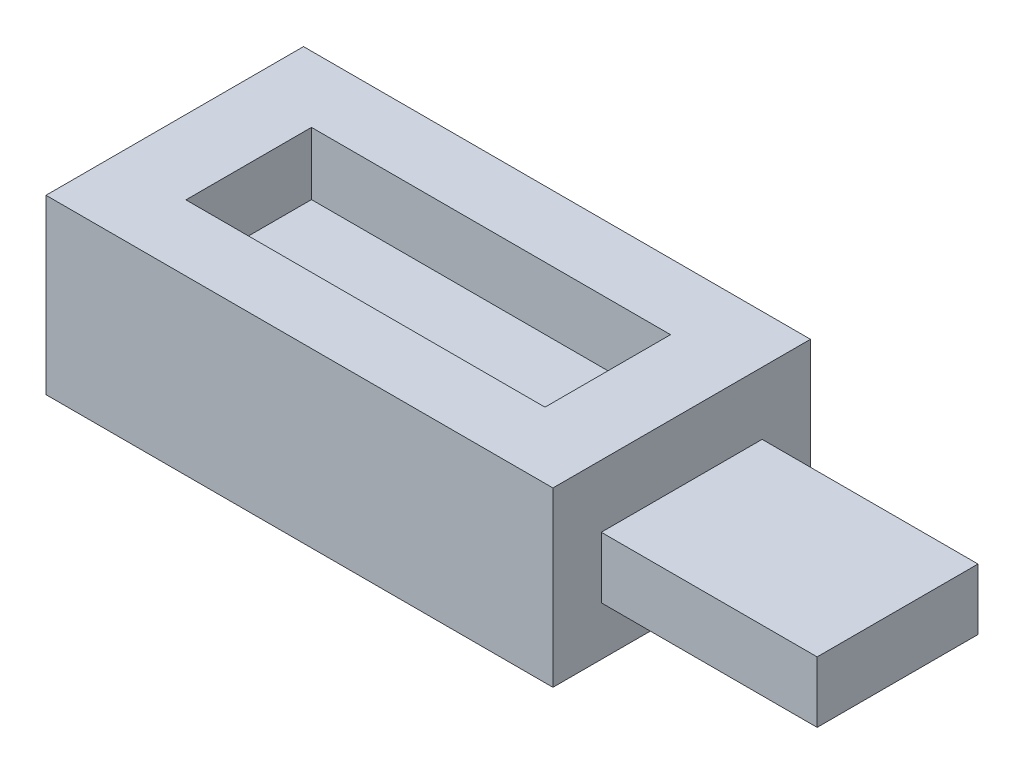
ISO-10303-21;
HEADER;
FILE_DESCRIPTION(('STEP AP214'),'2;1');
FILE_NAME('part.step','',(''),(''),'','','');
FILE_SCHEMA(('AUTOMOTIVE_DESIGN { 1 0 10303 214 1 1 1 1 }'));
ENDSEC;
DATA;
#1=APPLICATION_CONTEXT('core data for automotive mechanical design processes');
#2=APPLICATION_PROTOCOL_DEFINITION('international standard','automotive_design',2000,#1);
#3=PRODUCT_CONTEXT('',#1,'mechanical');
#4=PRODUCT('Part','Part','',(#3));
#5=PRODUCT_RELATED_PRODUCT_CATEGORY('part','',(#4));
#6=PRODUCT_DEFINITION_FORMATION('','',#4);
#7=PRODUCT_DEFINITION_CONTEXT('part definition',#1,'design');
#8=PRODUCT_DEFINITION('design','',#6,#7);
#9=PRODUCT_DEFINITION_SHAPE('','',#8);
#10=(LENGTH_UNIT() NAMED_UNIT(*) SI_UNIT(.MILLI.,.METRE.));
#11=(NAMED_UNIT(*) PLANE_ANGLE_UNIT() SI_UNIT($,.RADIAN.));
#12=(NAMED_UNIT(*) SI_UNIT($,.STERADIAN.) SOLID_ANGLE_UNIT());
#13=UNCERTAINTY_MEASURE_WITH_UNIT(LENGTH_MEASURE(1.E-05),#10,'distance_accuracy_value','');
#14=(GEOMETRIC_REPRESENTATION_CONTEXT(3) GLOBAL_UNCERTAINTY_ASSIGNED_CONTEXT((#13)) GLOBAL_UNIT_ASSIGNED_CONTEXT((#10,
#11,#12)) REPRESENTATION_CONTEXT('',''));
#15=CARTESIAN_POINT('',(0.,0.,0.));
#16=DIRECTION('',(0.,0.,1.));
#17=DIRECTION('',(1.,0.,0.));
#18=AXIS2_PLACEMENT_3D('',#15,#16,#17);
#19=CARTESIAN_POINT('',(102.892841401862,70.104,52.2673742227546));
#20=DIRECTION('',(-1.,0.,0.));
#21=DIRECTION('',(0.,0.,1.));
#22=AXIS2_PLACEMENT_3D('',#19,#20,#21);
#23=PLANE('',#22);
#24=DIRECTION('',(0.,0.,-1.));
#25=VECTOR('',#24,1.);
#26=CARTESIAN_POINT('',(102.892841401862,0.,52.2673742227546));
#27=LINE('',#26,#25);
#28=CARTESIAN_POINT('',(102.892841401862,0.,52.2673742227546));
#29=VERTEX_POINT('',#28);
#30=CARTESIAN_POINT('',(102.892841401862,0.,-52.2673742227546));
#31=VERTEX_POINT('',#30);
#32=EDGE_CURVE('E173',#29,#31,#27,.T.);
#33=ORIENTED_EDGE('',*,*,#32,.T.);
#34=DIRECTION('',(0.,-1.,0.));
#35=VECTOR('',#34,1.);
#36=CARTESIAN_POINT('',(102.892841401862,70.104,-52.2673742227546));
#37=LINE('',#36,#35);
#38=CARTESIAN_POINT('',(102.892841401862,70.104,-52.2673742227546));
#39=VERTEX_POINT('',#38);
#40=EDGE_CURVE('E11',#39,#31,#37,.T.);
#41=ORIENTED_EDGE('',*,*,#40,.F.);
#42=DIRECTION('',(0.,0.,-1.));
#43=VECTOR('',#42,1.);
#44=CARTESIAN_POINT('',(102.892841401862,70.104,52.2673742227546));
#45=LINE('',#44,#43);
#46=CARTESIAN_POINT('',(102.892841401862,70.104,52.2673742227546));
#47=VERTEX_POINT('',#46);
#48=EDGE_CURVE('E180',#47,#39,#45,.T.);
#49=ORIENTED_EDGE('',*,*,#48,.F.);
#50=DIRECTION('',(0.,-1.,0.));
#51=VECTOR('',#50,1.);
#52=CARTESIAN_POINT('',(102.892841401862,70.104,52.2673742227546));
#53=LINE('',#52,#51);
#54=EDGE_CURVE('E190',#47,#29,#53,.T.);
#55=ORIENTED_EDGE('',*,*,#54,.T.);
#56=EDGE_LOOP('',(#33,#41,#49,#55));
#57=FACE_BOUND('',#56,.T.);
#58=DIRECTION('',(0.,1.,0.));
#59=VECTOR('',#58,1.);
#60=CARTESIAN_POINT('',(102.892841401862,19.9219374383319,-32.6490823699169));
#61=LINE('',#60,#59);
#62=CARTESIAN_POINT('',(102.892841401862,19.9219374383319,-32.6490823699169));
#63=VERTEX_POINT('',#62);
#64=CARTESIAN_POINT('',(102.892841401862,44.7215888552026,-32.6490823699169));
#65=VERTEX_POINT('',#64);
#66=EDGE_CURVE('E141',#63,#65,#61,.T.);
#67=ORIENTED_EDGE('',*,*,#66,.F.);
#68=DIRECTION('',(0.,0.,-1.));
#69=VECTOR('',#68,1.);
#70=CARTESIAN_POINT('',(102.892841401862,19.9219374383319,32.6490823699169));
#71=LINE('',#70,#69);
#72=CARTESIAN_POINT('',(102.892841401862,19.9219374383319,32.6490823699169));
#73=VERTEX_POINT('',#72);
#74=EDGE_CURVE('E138',#73,#63,#71,.T.);
#75=ORIENTED_EDGE('',*,*,#74,.F.);
#76=DIRECTION('',(0.,-1.,0.));
#77=VECTOR('',#76,1.);
#78=CARTESIAN_POINT('',(102.892841401862,19.9219374383319,32.6490823699169));
#79=LINE('',#78,#77);
#80=CARTESIAN_POINT('',(102.892841401862,44.7215888552026,32.6490823699169));
#81=VERTEX_POINT('',#80);
#82=EDGE_CURVE('E52',#81,#73,#79,.T.);
#83=ORIENTED_EDGE('',*,*,#82,.F.);
#84=DIRECTION('',(0.,0.,1.));
#85=VECTOR('',#84,1.);
#86=CARTESIAN_POINT('',(102.892841401862,44.7215888552026,32.6490823699169));
#87=LINE('',#86,#85);
#88=EDGE_CURVE('E47',#65,#81,#87,.T.);
#89=ORIENTED_EDGE('',*,*,#88,.F.);
#90=EDGE_LOOP('',(#67,#75,#83,#89));
#91=FACE_BOUND('',#90,.T.);
#92=ADVANCED_FACE('F33',(#57,#91),#23,.F.);
#93=CARTESIAN_POINT('',(-102.892841401862,70.104,-52.2673742227546));
#94=DIRECTION('',(0.,0.,1.));
#95=DIRECTION('',(1.,0.,0.));
#96=AXIS2_PLACEMENT_3D('',#93,#94,#95);
#97=PLANE('',#96);
#98=DIRECTION('',(-1.,0.,0.));
#99=VECTOR('',#98,1.);
#100=CARTESIAN_POINT('',(-102.892841401862,0.,-52.2673742227546));
#101=LINE('',#100,#99);
#102=CARTESIAN_POINT('',(-102.892841401862,0.,-52.2673742227546));
#103=VERTEX_POINT('',#102);
#104=EDGE_CURVE('E193',#31,#103,#101,.T.);
#105=ORIENTED_EDGE('',*,*,#104,.T.);
#106=DIRECTION('',(0.,-1.,0.));
#107=VECTOR('',#106,1.);
#108=CARTESIAN_POINT('',(-102.892841401862,70.104,-52.2673742227546));
#109=LINE('',#108,#107);
#110=CARTESIAN_POINT('',(-102.892841401862,70.104,-52.2673742227546));
#111=VERTEX_POINT('',#110);
#112=EDGE_CURVE('E40',#111,#103,#109,.T.);
#113=ORIENTED_EDGE('',*,*,#112,.F.);
#114=DIRECTION('',(-1.,0.,0.));
#115=VECTOR('',#114,1.);
#116=CARTESIAN_POINT('',(-102.892841401862,70.104,-52.2673742227546));
#117=LINE('',#116,#115);
#118=EDGE_CURVE('E183',#39,#111,#117,.T.);
#119=ORIENTED_EDGE('',*,*,#118,.F.);
#120=ORIENTED_EDGE('',*,*,#40,.T.);
#121=EDGE_LOOP('',(#105,#113,#119,#120));
#122=FACE_BOUND('',#121,.T.);
#123=ADVANCED_FACE('F223',(#122),#97,.F.);
#124=CARTESIAN_POINT('',(-102.892841401862,70.104,52.2673742227546));
#125=DIRECTION('',(1.,0.,0.));
#126=DIRECTION('',(0.,0.,-1.));
#127=AXIS2_PLACEMENT_3D('',#124,#125,#126);
#128=PLANE('',#127);
#129=DIRECTION('',(0.,0.,1.));
#130=VECTOR('',#129,1.);
#131=CARTESIAN_POINT('',(-102.892841401862,0.,52.2673742227546));
#132=LINE('',#131,#130);
#133=CARTESIAN_POINT('',(-102.892841401862,0.,52.2673742227546));
#134=VERTEX_POINT('',#133);
#135=EDGE_CURVE('E195',#103,#134,#132,.T.);
#136=ORIENTED_EDGE('',*,*,#135,.T.);
#137=DIRECTION('',(0.,-1.,0.));
#138=VECTOR('',#137,1.);
#139=CARTESIAN_POINT('',(-102.892841401862,70.104,52.2673742227546));
#140=LINE('',#139,#138);
#141=CARTESIAN_POINT('',(-102.892841401862,70.104,52.2673742227546));
#142=VERTEX_POINT('',#141);
#143=EDGE_CURVE('E200',#142,#134,#140,.T.);
#144=ORIENTED_EDGE('',*,*,#143,.F.);
#145=DIRECTION('',(0.,0.,1.));
#146=VECTOR('',#145,1.);
#147=CARTESIAN_POINT('',(-102.892841401862,70.104,52.2673742227546));
#148=LINE('',#147,#146);
#149=EDGE_CURVE('E186',#111,#142,#148,.T.);
#150=ORIENTED_EDGE('',*,*,#149,.F.);
#151=ORIENTED_EDGE('',*,*,#112,.T.);
#152=EDGE_LOOP('',(#136,#144,#150,#151));
#153=FACE_BOUND('',#152,.T.);
#154=ADVANCED_FACE('F207',(#153),#128,.F.);
#155=CARTESIAN_POINT('',(-102.892841401862,70.104,52.2673742227546));
#156=DIRECTION('',(0.,0.,-1.));
#157=DIRECTION('',(-1.,0.,0.));
#158=AXIS2_PLACEMENT_3D('',#155,#156,#157);
#159=PLANE('',#158);
#160=DIRECTION('',(1.,0.,0.));
#161=VECTOR('',#160,1.);
#162=CARTESIAN_POINT('',(-102.892841401862,0.,52.2673742227546));
#163=LINE('',#162,#161);
#164=EDGE_CURVE('E184',#134,#29,#163,.T.);
#165=ORIENTED_EDGE('',*,*,#164,.T.);
#166=ORIENTED_EDGE('',*,*,#54,.F.);
#167=DIRECTION('',(1.,0.,0.));
#168=VECTOR('',#167,1.);
#169=CARTESIAN_POINT('',(-102.892841401862,70.104,52.2673742227546));
#170=LINE('',#169,#168);
#171=EDGE_CURVE('E188',#142,#47,#170,.T.);
#172=ORIENTED_EDGE('',*,*,#171,.F.);
#173=ORIENTED_EDGE('',*,*,#143,.T.);
#174=EDGE_LOOP('',(#165,#166,#172,#173));
#175=FACE_BOUND('',#174,.T.);
#176=ADVANCED_FACE('F216',(#175),#159,.F.);
#177=CARTESIAN_POINT('',(0.,70.104,0.));
#178=DIRECTION('',(0.,-1.,0.));
#179=DIRECTION('',(0.,0.,-1.));
#180=AXIS2_PLACEMENT_3D('',#177,#178,#179);
#181=PLANE('',#180);
#182=DIRECTION('',(-1.,0.,0.));
#183=VECTOR('',#182,1.);
#184=CARTESIAN_POINT('',(-72.8794328331901,70.104,-25.4870488631695));
#185=LINE('',#184,#183);
#186=CARTESIAN_POINT('',(72.8794328331901,70.104,-25.4870488631695));
#187=VERTEX_POINT('',#186);
#188=CARTESIAN_POINT('',(-72.8794328331901,70.104,-25.4870488631695));
#189=VERTEX_POINT('',#188);
#190=EDGE_CURVE('E144',#187,#189,#185,.T.);
#191=ORIENTED_EDGE('',*,*,#190,.F.);
#192=DIRECTION('',(0.,0.,-1.));
#193=VECTOR('',#192,1.);
#194=CARTESIAN_POINT('',(72.8794328331901,70.104,25.4870488631695));
#195=LINE('',#194,#193);
#196=CARTESIAN_POINT('',(72.8794328331901,70.104,25.4870488631695));
#197=VERTEX_POINT('',#196);
#198=EDGE_CURVE('E142',#197,#187,#195,.T.);
#199=ORIENTED_EDGE('',*,*,#198,.F.);
#200=DIRECTION('',(1.,0.,0.));
#201=VECTOR('',#200,1.);
#202=CARTESIAN_POINT('',(-72.8794328331901,70.104,25.4870488631695));
#203=LINE('',#202,#201);
#204=CARTESIAN_POINT('',(-72.8794328331901,70.104,25.4870488631695));
#205=VERTEX_POINT('',#204);
#206=EDGE_CURVE('E154',#205,#197,#203,.T.);
#207=ORIENTED_EDGE('',*,*,#206,.F.);
#208=DIRECTION('',(0.,0.,1.));
#209=VECTOR('',#208,1.);
#210=CARTESIAN_POINT('',(-72.8794328331901,70.104,25.4870488631695));
#211=LINE('',#210,#209);
#212=EDGE_CURVE('E166',#189,#205,#211,.T.);
#213=ORIENTED_EDGE('',*,*,#212,.F.);
#214=EDGE_LOOP('',(#191,#199,#207,#213));
#215=FACE_BOUND('',#214,.T.);
#216=ORIENTED_EDGE('',*,*,#48,.T.);
#217=ORIENTED_EDGE('',*,*,#118,.T.);
#218=ORIENTED_EDGE('',*,*,#149,.T.);
#219=ORIENTED_EDGE('',*,*,#171,.T.);
#220=EDGE_LOOP('',(#216,#217,#218,#219));
#221=FACE_BOUND('',#220,.T.);
#222=ADVANCED_FACE('F222',(#215,#221),#181,.F.);
#223=CARTESIAN_POINT('',(0.,0.,0.));
#224=DIRECTION('',(0.,-1.,0.));
#225=DIRECTION('',(0.,0.,-1.));
#226=AXIS2_PLACEMENT_3D('',#223,#224,#225);
#227=PLANE('',#226);
#228=ORIENTED_EDGE('',*,*,#32,.F.);
#229=ORIENTED_EDGE('',*,*,#164,.F.);
#230=ORIENTED_EDGE('',*,*,#135,.F.);
#231=ORIENTED_EDGE('',*,*,#104,.F.);
#232=EDGE_LOOP('',(#228,#229,#230,#231));
#233=FACE_BOUND('',#232,.T.);
#234=ADVANCED_FACE('F213',(#233),#227,.T.);
#235=CARTESIAN_POINT('',(72.8794328331901,44.704,25.4870488631695));
#236=DIRECTION('',(1.,0.,0.));
#237=DIRECTION('',(0.,0.,-1.));
#238=AXIS2_PLACEMENT_3D('',#235,#236,#237);
#239=PLANE('',#238);
#240=ORIENTED_EDGE('',*,*,#198,.T.);
#241=DIRECTION('',(0.,1.,0.));
#242=VECTOR('',#241,1.);
#243=CARTESIAN_POINT('',(72.8794328331901,44.704,-25.4870488631695));
#244=LINE('',#243,#242);
#245=CARTESIAN_POINT('',(72.8794328331901,44.704,-25.4870488631695));
#246=VERTEX_POINT('',#245);
#247=EDGE_CURVE('E162',#246,#187,#244,.T.);
#248=ORIENTED_EDGE('',*,*,#247,.F.);
#249=DIRECTION('',(0.,0.,-1.));
#250=VECTOR('',#249,1.);
#251=CARTESIAN_POINT('',(72.8794328331901,44.704,25.4870488631695));
#252=LINE('',#251,#250);
#253=CARTESIAN_POINT('',(72.8794328331901,44.704,25.4870488631695));
#254=VERTEX_POINT('',#253);
#255=EDGE_CURVE('E150',#254,#246,#252,.T.);
#256=ORIENTED_EDGE('',*,*,#255,.F.);
#257=DIRECTION('',(0.,1.,0.));
#258=VECTOR('',#257,1.);
#259=CARTESIAN_POINT('',(72.8794328331901,44.704,25.4870488631695));
#260=LINE('',#259,#258);
#261=EDGE_CURVE('E171',#254,#197,#260,.T.);
#262=ORIENTED_EDGE('',*,*,#261,.T.);
#263=EDGE_LOOP('',(#240,#248,#256,#262));
#264=FACE_BOUND('',#263,.T.);
#265=ADVANCED_FACE('F235',(#264),#239,.F.);
#266=CARTESIAN_POINT('',(-72.8794328331901,44.704,25.4870488631695));
#267=DIRECTION('',(0.,0.,1.));
#268=DIRECTION('',(1.,0.,0.));
#269=AXIS2_PLACEMENT_3D('',#266,#267,#268);
#270=PLANE('',#269);
#271=ORIENTED_EDGE('',*,*,#206,.T.);
#272=ORIENTED_EDGE('',*,*,#261,.F.);
#273=DIRECTION('',(1.,0.,0.));
#274=VECTOR('',#273,1.);
#275=CARTESIAN_POINT('',(-72.8794328331901,44.704,25.4870488631695));
#276=LINE('',#275,#274);
#277=CARTESIAN_POINT('',(-72.8794328331901,44.704,25.4870488631695));
#278=VERTEX_POINT('',#277);
#279=EDGE_CURVE('E160',#278,#254,#276,.T.);
#280=ORIENTED_EDGE('',*,*,#279,.F.);
#281=DIRECTION('',(0.,1.,0.));
#282=VECTOR('',#281,1.);
#283=CARTESIAN_POINT('',(-72.8794328331901,44.704,25.4870488631695));
#284=LINE('',#283,#282);
#285=EDGE_CURVE('E174',#278,#205,#284,.T.);
#286=ORIENTED_EDGE('',*,*,#285,.T.);
#287=EDGE_LOOP('',(#271,#272,#280,#286));
#288=FACE_BOUND('',#287,.T.);
#289=ADVANCED_FACE('F241',(#288),#270,.F.);
#290=CARTESIAN_POINT('',(-72.8794328331901,44.704,25.4870488631695));
#291=DIRECTION('',(-1.,0.,0.));
#292=DIRECTION('',(0.,0.,1.));
#293=AXIS2_PLACEMENT_3D('',#290,#291,#292);
#294=PLANE('',#293);
#295=ORIENTED_EDGE('',*,*,#212,.T.);
#296=ORIENTED_EDGE('',*,*,#285,.F.);
#297=DIRECTION('',(0.,0.,1.));
#298=VECTOR('',#297,1.);
#299=CARTESIAN_POINT('',(-72.8794328331901,44.704,25.4870488631695));
#300=LINE('',#299,#298);
#301=CARTESIAN_POINT('',(-72.8794328331901,44.704,-25.4870488631695));
#302=VERTEX_POINT('',#301);
#303=EDGE_CURVE('E157',#302,#278,#300,.T.);
#304=ORIENTED_EDGE('',*,*,#303,.F.);
#305=DIRECTION('',(0.,1.,0.));
#306=VECTOR('',#305,1.);
#307=CARTESIAN_POINT('',(-72.8794328331901,44.704,-25.4870488631695));
#308=LINE('',#307,#306);
#309=EDGE_CURVE('E176',#302,#189,#308,.T.);
#310=ORIENTED_EDGE('',*,*,#309,.T.);
#311=EDGE_LOOP('',(#295,#296,#304,#310));
#312=FACE_BOUND('',#311,.T.);
#313=ADVANCED_FACE('F247',(#312),#294,.F.);
#314=CARTESIAN_POINT('',(-72.8794328331901,44.704,-25.4870488631695));
#315=DIRECTION('',(0.,0.,-1.));
#316=DIRECTION('',(-1.,0.,0.));
#317=AXIS2_PLACEMENT_3D('',#314,#315,#316);
#318=PLANE('',#317);
#319=ORIENTED_EDGE('',*,*,#190,.T.);
#320=ORIENTED_EDGE('',*,*,#309,.F.);
#321=DIRECTION('',(-1.,0.,0.));
#322=VECTOR('',#321,1.);
#323=CARTESIAN_POINT('',(-72.8794328331901,44.704,-25.4870488631695));
#324=LINE('',#323,#322);
#325=EDGE_CURVE('E153',#246,#302,#324,.T.);
#326=ORIENTED_EDGE('',*,*,#325,.F.);
#327=ORIENTED_EDGE('',*,*,#247,.T.);
#328=EDGE_LOOP('',(#319,#320,#326,#327));
#329=FACE_BOUND('',#328,.T.);
#330=ADVANCED_FACE('F243',(#329),#318,.F.);
#331=CARTESIAN_POINT('',(0.,44.704,0.));
#332=DIRECTION('',(0.,-1.,0.));
#333=DIRECTION('',(0.,0.,-1.));
#334=AXIS2_PLACEMENT_3D('',#331,#332,#333);
#335=PLANE('',#334);
#336=ORIENTED_EDGE('',*,*,#255,.T.);
#337=ORIENTED_EDGE('',*,*,#325,.T.);
#338=ORIENTED_EDGE('',*,*,#303,.T.);
#339=ORIENTED_EDGE('',*,*,#279,.T.);
#340=EDGE_LOOP('',(#336,#337,#338,#339));
#341=FACE_BOUND('',#340,.T.);
#342=ADVANCED_FACE('F246',(#341),#335,.F.);
#343=CARTESIAN_POINT('',(190.522841401863,19.9219374383319,-32.6490823699169));
#344=DIRECTION('',(0.,0.,1.));
#345=DIRECTION('',(1.,0.,0.));
#346=AXIS2_PLACEMENT_3D('',#343,#344,#345);
#347=PLANE('',#346);
#348=ORIENTED_EDGE('',*,*,#66,.T.);
#349=DIRECTION('',(-1.,0.,0.));
#350=VECTOR('',#349,1.);
#351=CARTESIAN_POINT('',(190.522841401863,44.7215888552026,-32.6490823699169));
#352=LINE('',#351,#350);
#353=CARTESIAN_POINT('',(190.522841401863,44.7215888552026,-32.6490823699169));
#354=VERTEX_POINT('',#353);
#355=EDGE_CURVE('E122',#354,#65,#352,.T.);
#356=ORIENTED_EDGE('',*,*,#355,.F.);
#357=DIRECTION('',(0.,1.,0.));
#358=VECTOR('',#357,1.);
#359=CARTESIAN_POINT('',(190.522841401863,19.9219374383319,-32.6490823699169));
#360=LINE('',#359,#358);
#361=CARTESIAN_POINT('',(190.522841401863,19.9219374383319,-32.6490823699169));
#362=VERTEX_POINT('',#361);
#363=EDGE_CURVE('E129',#362,#354,#360,.T.);
#364=ORIENTED_EDGE('',*,*,#363,.F.);
#365=DIRECTION('',(-1.,0.,0.));
#366=VECTOR('',#365,1.);
#367=CARTESIAN_POINT('',(190.522841401863,19.9219374383319,-32.6490823699169));
#368=LINE('',#367,#366);
#369=EDGE_CURVE('E367',#362,#63,#368,.T.);
#370=ORIENTED_EDGE('',*,*,#369,.T.);
#371=EDGE_LOOP('',(#348,#356,#364,#370));
#372=FACE_BOUND('',#371,.T.);
#373=ADVANCED_FACE('F140',(#372),#347,.F.);
#374=CARTESIAN_POINT('',(190.522841401863,44.7215888552026,32.6490823699169));
#375=DIRECTION('',(0.,-1.,0.));
#376=DIRECTION('',(0.,0.,-1.));
#377=AXIS2_PLACEMENT_3D('',#374,#375,#376);
#378=PLANE('',#377);
#379=ORIENTED_EDGE('',*,*,#88,.T.);
#380=DIRECTION('',(-1.,0.,0.));
#381=VECTOR('',#380,1.);
#382=CARTESIAN_POINT('',(190.522841401863,44.7215888552026,32.6490823699169));
#383=LINE('',#382,#381);
#384=CARTESIAN_POINT('',(190.522841401863,44.7215888552026,32.6490823699169));
#385=VERTEX_POINT('',#384);
#386=EDGE_CURVE('E125',#385,#81,#383,.T.);
#387=ORIENTED_EDGE('',*,*,#386,.F.);
#388=DIRECTION('',(0.,0.,1.));
#389=VECTOR('',#388,1.);
#390=CARTESIAN_POINT('',(190.522841401863,44.7215888552026,32.6490823699169));
#391=LINE('',#390,#389);
#392=EDGE_CURVE('E118',#354,#385,#391,.T.);
#393=ORIENTED_EDGE('',*,*,#392,.F.);
#394=ORIENTED_EDGE('',*,*,#355,.T.);
#395=EDGE_LOOP('',(#379,#387,#393,#394));
#396=FACE_BOUND('',#395,.T.);
#397=ADVANCED_FACE('F120',(#396),#378,.F.);
#398=CARTESIAN_POINT('',(190.522841401863,19.9219374383319,32.6490823699169));
#399=DIRECTION('',(0.,0.,-1.));
#400=DIRECTION('',(-1.,0.,0.));
#401=AXIS2_PLACEMENT_3D('',#398,#399,#400);
#402=PLANE('',#401);
#403=ORIENTED_EDGE('',*,*,#82,.T.);
#404=DIRECTION('',(-1.,0.,0.));
#405=VECTOR('',#404,1.);
#406=CARTESIAN_POINT('',(190.522841401863,19.9219374383319,32.6490823699169));
#407=LINE('',#406,#405);
#408=CARTESIAN_POINT('',(190.522841401863,19.9219374383319,32.6490823699169));
#409=VERTEX_POINT('',#408);
#410=EDGE_CURVE('E146',#409,#73,#407,.T.);
#411=ORIENTED_EDGE('',*,*,#410,.F.);
#412=DIRECTION('',(0.,-1.,0.));
#413=VECTOR('',#412,1.);
#414=CARTESIAN_POINT('',(190.522841401863,19.9219374383319,32.6490823699169));
#415=LINE('',#414,#413);
#416=EDGE_CURVE('E128',#385,#409,#415,.T.);
#417=ORIENTED_EDGE('',*,*,#416,.F.);
#418=ORIENTED_EDGE('',*,*,#386,.T.);
#419=EDGE_LOOP('',(#403,#411,#417,#418));
#420=FACE_BOUND('',#419,.T.);
#421=ADVANCED_FACE('F262',(#420),#402,.F.);
#422=CARTESIAN_POINT('',(190.522841401863,19.9219374383319,32.6490823699169));
#423=DIRECTION('',(0.,1.,0.));
#424=DIRECTION('',(0.,0.,1.));
#425=AXIS2_PLACEMENT_3D('',#422,#423,#424);
#426=PLANE('',#425);
#427=ORIENTED_EDGE('',*,*,#74,.T.);
#428=ORIENTED_EDGE('',*,*,#369,.F.);
#429=DIRECTION('',(0.,0.,-1.));
#430=VECTOR('',#429,1.);
#431=CARTESIAN_POINT('',(190.522841401863,19.9219374383319,32.6490823699169));
#432=LINE('',#431,#430);
#433=EDGE_CURVE('E134',#409,#362,#432,.T.);
#434=ORIENTED_EDGE('',*,*,#433,.F.);
#435=ORIENTED_EDGE('',*,*,#410,.T.);
#436=EDGE_LOOP('',(#427,#428,#434,#435));
#437=FACE_BOUND('',#436,.T.);
#438=ADVANCED_FACE('F265',(#437),#426,.F.);
#439=CARTESIAN_POINT('',(190.522841401863,0.,0.));
#440=DIRECTION('',(-1.,0.,0.));
#441=DIRECTION('',(0.,0.,1.));
#442=AXIS2_PLACEMENT_3D('',#439,#440,#441);
#443=PLANE('',#442);
#444=ORIENTED_EDGE('',*,*,#363,.T.);
#445=ORIENTED_EDGE('',*,*,#392,.T.);
#446=ORIENTED_EDGE('',*,*,#416,.T.);
#447=ORIENTED_EDGE('',*,*,#433,.T.);
#448=EDGE_LOOP('',(#444,#445,#446,#447));
#449=FACE_BOUND('',#448,.T.);
#450=ADVANCED_FACE('F132',(#449),#443,.F.);
#451=CLOSED_SHELL('',(#92,#123,#154,#176,#222,#234,#265,#289,#313,#330,#342,#373,#397,#421,#438,#450));
#452=MANIFOLD_SOLID_BREP('B2',#451);
#453=ADVANCED_BREP_SHAPE_REPRESENTATION('',(#18,#452),#14);
#454=SHAPE_DEFINITION_REPRESENTATION(#9,#453);
ENDSEC;
END-ISO-10303-21;
